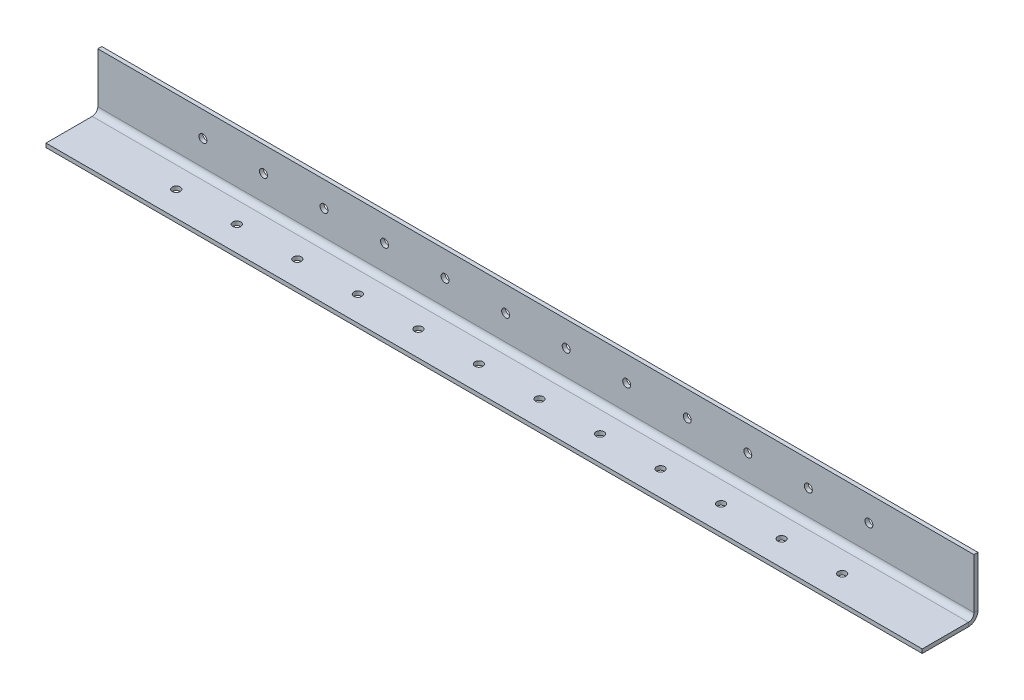
ISO-10303-21;
HEADER;
FILE_DESCRIPTION(('STEP AP214'),'2;1');
FILE_NAME('part.step','',(''),(''),'','','');
FILE_SCHEMA(('AUTOMOTIVE_DESIGN { 1 0 10303 214 1 1 1 1 }'));
ENDSEC;
DATA;
#1=APPLICATION_CONTEXT('core data for automotive mechanical design processes');
#2=APPLICATION_PROTOCOL_DEFINITION('international standard','automotive_design',2000,#1);
#3=PRODUCT_CONTEXT('',#1,'mechanical');
#4=PRODUCT('Part','Part','',(#3));
#5=PRODUCT_RELATED_PRODUCT_CATEGORY('part','',(#4));
#6=PRODUCT_DEFINITION_FORMATION('','',#4);
#7=PRODUCT_DEFINITION_CONTEXT('part definition',#1,'design');
#8=PRODUCT_DEFINITION('design','',#6,#7);
#9=PRODUCT_DEFINITION_SHAPE('','',#8);
#10=(LENGTH_UNIT() NAMED_UNIT(*) SI_UNIT(.MILLI.,.METRE.));
#11=(NAMED_UNIT(*) PLANE_ANGLE_UNIT() SI_UNIT($,.RADIAN.));
#12=(NAMED_UNIT(*) SI_UNIT($,.STERADIAN.) SOLID_ANGLE_UNIT());
#13=UNCERTAINTY_MEASURE_WITH_UNIT(LENGTH_MEASURE(1.E-05),#10,'distance_accuracy_value','');
#14=(GEOMETRIC_REPRESENTATION_CONTEXT(3) GLOBAL_UNCERTAINTY_ASSIGNED_CONTEXT((#13)) GLOBAL_UNIT_ASSIGNED_CONTEXT((#10,
#11,#12)) REPRESENTATION_CONTEXT('',''));
#15=CARTESIAN_POINT('',(0.,0.,0.));
#16=DIRECTION('',(0.,0.,1.));
#17=DIRECTION('',(1.,0.,0.));
#18=AXIS2_PLACEMENT_3D('',#15,#16,#17);
#19=CARTESIAN_POINT('',(836.,12.,0.));
#20=DIRECTION('',(0.,0.,-1.));
#21=DIRECTION('',(-1.,0.,0.));
#22=AXIS2_PLACEMENT_3D('',#19,#20,#21);
#23=CYLINDRICAL_SURFACE('',#22,10.0000000000001);
#24=CARTESIAN_POINT('',(836.,12.,0.));
#25=DIRECTION('',(0.,0.,-1.));
#26=DIRECTION('',(-1.,0.,0.));
#27=AXIS2_PLACEMENT_3D('',#24,#25,#26);
#28=CIRCLE('',#27,10.0000000000001);
#29=CARTESIAN_POINT('',(826.,12.,0.));
#30=VERTEX_POINT('',#29);
#31=EDGE_CURVE('E82',#30,#30,#28,.T.);
#32=ORIENTED_EDGE('',*,*,#31,.F.);
#33=EDGE_LOOP('',(#32));
#34=FACE_BOUND('',#33,.T.);
#35=CARTESIAN_POINT('',(836.,12.,-9.99999999999998));
#36=DIRECTION('',(0.,0.,-1.));
#37=DIRECTION('',(-1.,0.,0.));
#38=AXIS2_PLACEMENT_3D('',#35,#36,#37);
#39=CIRCLE('',#38,10.0000000000001);
#40=CARTESIAN_POINT('',(826.,12.,-9.99999999999998));
#41=VERTEX_POINT('',#40);
#42=EDGE_CURVE('E15',#41,#41,#39,.T.);
#43=ORIENTED_EDGE('',*,*,#42,.T.);
#44=EDGE_LOOP('',(#43));
#45=FACE_BOUND('',#44,.T.);
#46=ADVANCED_FACE('F74',(#34,#45),#23,.F.);
#47=CARTESIAN_POINT('',(684.,12.,0.));
#48=DIRECTION('',(0.,0.,-1.));
#49=DIRECTION('',(-1.,0.,0.));
#50=AXIS2_PLACEMENT_3D('',#47,#48,#49);
#51=CYLINDRICAL_SURFACE('',#50,10.0000000000001);
#52=CARTESIAN_POINT('',(684.,12.,0.));
#53=DIRECTION('',(0.,0.,-1.));
#54=DIRECTION('',(-1.,0.,0.));
#55=AXIS2_PLACEMENT_3D('',#52,#53,#54);
#56=CIRCLE('',#55,10.0000000000001);
#57=CARTESIAN_POINT('',(674.,12.,0.));
#58=VERTEX_POINT('',#57);
#59=EDGE_CURVE('E210',#58,#58,#56,.T.);
#60=ORIENTED_EDGE('',*,*,#59,.F.);
#61=EDGE_LOOP('',(#60));
#62=FACE_BOUND('',#61,.T.);
#63=CARTESIAN_POINT('',(684.,12.,-9.99999999999998));
#64=DIRECTION('',(0.,0.,-1.));
#65=DIRECTION('',(-1.,0.,0.));
#66=AXIS2_PLACEMENT_3D('',#63,#64,#65);
#67=CIRCLE('',#66,10.0000000000001);
#68=CARTESIAN_POINT('',(674.,12.,-9.99999999999998));
#69=VERTEX_POINT('',#68);
#70=EDGE_CURVE('E214',#69,#69,#67,.T.);
#71=ORIENTED_EDGE('',*,*,#70,.T.);
#72=EDGE_LOOP('',(#71));
#73=FACE_BOUND('',#72,.T.);
#74=ADVANCED_FACE('F225',(#62,#73),#51,.F.);
#75=CARTESIAN_POINT('',(532.,12.,0.));
#76=DIRECTION('',(0.,0.,-1.));
#77=DIRECTION('',(-1.,0.,0.));
#78=AXIS2_PLACEMENT_3D('',#75,#76,#77);
#79=CYLINDRICAL_SURFACE('',#78,10.0000000000001);
#80=CARTESIAN_POINT('',(532.,12.,0.));
#81=DIRECTION('',(0.,0.,-1.));
#82=DIRECTION('',(-1.,0.,0.));
#83=AXIS2_PLACEMENT_3D('',#80,#81,#82);
#84=CIRCLE('',#83,10.0000000000001);
#85=CARTESIAN_POINT('',(522.,12.,0.));
#86=VERTEX_POINT('',#85);
#87=EDGE_CURVE('E202',#86,#86,#84,.T.);
#88=ORIENTED_EDGE('',*,*,#87,.F.);
#89=EDGE_LOOP('',(#88));
#90=FACE_BOUND('',#89,.T.);
#91=CARTESIAN_POINT('',(532.,12.,-9.99999999999999));
#92=DIRECTION('',(0.,0.,-1.));
#93=DIRECTION('',(-1.,0.,0.));
#94=AXIS2_PLACEMENT_3D('',#91,#92,#93);
#95=CIRCLE('',#94,10.0000000000001);
#96=CARTESIAN_POINT('',(522.,12.,-9.99999999999999));
#97=VERTEX_POINT('',#96);
#98=EDGE_CURVE('E206',#97,#97,#95,.T.);
#99=ORIENTED_EDGE('',*,*,#98,.T.);
#100=EDGE_LOOP('',(#99));
#101=FACE_BOUND('',#100,.T.);
#102=ADVANCED_FACE('F279',(#90,#101),#79,.F.);
#103=CARTESIAN_POINT('',(380.,12.,0.));
#104=DIRECTION('',(0.,0.,-1.));
#105=DIRECTION('',(-1.,0.,0.));
#106=AXIS2_PLACEMENT_3D('',#103,#104,#105);
#107=CYLINDRICAL_SURFACE('',#106,10.0000000000001);
#108=CARTESIAN_POINT('',(380.,12.,0.));
#109=DIRECTION('',(0.,0.,-1.));
#110=DIRECTION('',(-1.,0.,0.));
#111=AXIS2_PLACEMENT_3D('',#108,#109,#110);
#112=CIRCLE('',#111,10.0000000000001);
#113=CARTESIAN_POINT('',(370.,12.,0.));
#114=VERTEX_POINT('',#113);
#115=EDGE_CURVE('E194',#114,#114,#112,.T.);
#116=ORIENTED_EDGE('',*,*,#115,.F.);
#117=EDGE_LOOP('',(#116));
#118=FACE_BOUND('',#117,.T.);
#119=CARTESIAN_POINT('',(380.,12.,-9.99999999999999));
#120=DIRECTION('',(0.,0.,-1.));
#121=DIRECTION('',(-1.,0.,0.));
#122=AXIS2_PLACEMENT_3D('',#119,#120,#121);
#123=CIRCLE('',#122,10.0000000000001);
#124=CARTESIAN_POINT('',(370.,12.,-9.99999999999999));
#125=VERTEX_POINT('',#124);
#126=EDGE_CURVE('E198',#125,#125,#123,.T.);
#127=ORIENTED_EDGE('',*,*,#126,.T.);
#128=EDGE_LOOP('',(#127));
#129=FACE_BOUND('',#128,.T.);
#130=ADVANCED_FACE('F275',(#118,#129),#107,.F.);
#131=CARTESIAN_POINT('',(228.,12.,0.));
#132=DIRECTION('',(0.,0.,-1.));
#133=DIRECTION('',(-1.,0.,0.));
#134=AXIS2_PLACEMENT_3D('',#131,#132,#133);
#135=CYLINDRICAL_SURFACE('',#134,10.0000000000001);
#136=CARTESIAN_POINT('',(228.,12.,0.));
#137=DIRECTION('',(0.,0.,-1.));
#138=DIRECTION('',(-1.,0.,0.));
#139=AXIS2_PLACEMENT_3D('',#136,#137,#138);
#140=CIRCLE('',#139,10.0000000000001);
#141=CARTESIAN_POINT('',(218.,12.,0.));
#142=VERTEX_POINT('',#141);
#143=EDGE_CURVE('E186',#142,#142,#140,.T.);
#144=ORIENTED_EDGE('',*,*,#143,.F.);
#145=EDGE_LOOP('',(#144));
#146=FACE_BOUND('',#145,.T.);
#147=CARTESIAN_POINT('',(228.,12.,-9.99999999999999));
#148=DIRECTION('',(0.,0.,-1.));
#149=DIRECTION('',(-1.,0.,0.));
#150=AXIS2_PLACEMENT_3D('',#147,#148,#149);
#151=CIRCLE('',#150,10.0000000000001);
#152=CARTESIAN_POINT('',(218.,12.,-9.99999999999999));
#153=VERTEX_POINT('',#152);
#154=EDGE_CURVE('E190',#153,#153,#151,.T.);
#155=ORIENTED_EDGE('',*,*,#154,.T.);
#156=EDGE_LOOP('',(#155));
#157=FACE_BOUND('',#156,.T.);
#158=ADVANCED_FACE('F271',(#146,#157),#135,.F.);
#159=CARTESIAN_POINT('',(75.9999999999998,12.,0.));
#160=DIRECTION('',(0.,0.,-1.));
#161=DIRECTION('',(-1.,0.,0.));
#162=AXIS2_PLACEMENT_3D('',#159,#160,#161);
#163=CYLINDRICAL_SURFACE('',#162,10.0000000000001);
#164=CARTESIAN_POINT('',(75.9999999999998,12.,0.));
#165=DIRECTION('',(0.,0.,-1.));
#166=DIRECTION('',(-1.,0.,0.));
#167=AXIS2_PLACEMENT_3D('',#164,#165,#166);
#168=CIRCLE('',#167,10.0000000000001);
#169=CARTESIAN_POINT('',(65.9999999999998,12.,0.));
#170=VERTEX_POINT('',#169);
#171=EDGE_CURVE('E178',#170,#170,#168,.T.);
#172=ORIENTED_EDGE('',*,*,#171,.F.);
#173=EDGE_LOOP('',(#172));
#174=FACE_BOUND('',#173,.T.);
#175=CARTESIAN_POINT('',(75.9999999999998,12.,-9.99999999999999));
#176=DIRECTION('',(0.,0.,-1.));
#177=DIRECTION('',(-1.,0.,0.));
#178=AXIS2_PLACEMENT_3D('',#175,#176,#177);
#179=CIRCLE('',#178,10.0000000000001);
#180=CARTESIAN_POINT('',(65.9999999999998,12.,-9.99999999999999));
#181=VERTEX_POINT('',#180);
#182=EDGE_CURVE('E182',#181,#181,#179,.T.);
#183=ORIENTED_EDGE('',*,*,#182,.T.);
#184=EDGE_LOOP('',(#183));
#185=FACE_BOUND('',#184,.T.);
#186=ADVANCED_FACE('F267',(#174,#185),#163,.F.);
#187=CARTESIAN_POINT('',(-76.0000000000001,12.,0.));
#188=DIRECTION('',(0.,0.,-1.));
#189=DIRECTION('',(-1.,0.,0.));
#190=AXIS2_PLACEMENT_3D('',#187,#188,#189);
#191=CYLINDRICAL_SURFACE('',#190,10.0000000000001);
#192=CARTESIAN_POINT('',(-76.0000000000001,12.,0.));
#193=DIRECTION('',(0.,0.,-1.));
#194=DIRECTION('',(-1.,0.,0.));
#195=AXIS2_PLACEMENT_3D('',#192,#193,#194);
#196=CIRCLE('',#195,10.0000000000001);
#197=CARTESIAN_POINT('',(-86.0000000000002,12.,0.));
#198=VERTEX_POINT('',#197);
#199=EDGE_CURVE('E170',#198,#198,#196,.T.);
#200=ORIENTED_EDGE('',*,*,#199,.F.);
#201=EDGE_LOOP('',(#200));
#202=FACE_BOUND('',#201,.T.);
#203=CARTESIAN_POINT('',(-76.0000000000001,12.,-9.99999999999999));
#204=DIRECTION('',(0.,0.,-1.));
#205=DIRECTION('',(-1.,0.,0.));
#206=AXIS2_PLACEMENT_3D('',#203,#204,#205);
#207=CIRCLE('',#206,10.0000000000001);
#208=CARTESIAN_POINT('',(-86.0000000000002,12.,-9.99999999999999));
#209=VERTEX_POINT('',#208);
#210=EDGE_CURVE('E174',#209,#209,#207,.T.);
#211=ORIENTED_EDGE('',*,*,#210,.T.);
#212=EDGE_LOOP('',(#211));
#213=FACE_BOUND('',#212,.T.);
#214=ADVANCED_FACE('F263',(#202,#213),#191,.F.);
#215=CARTESIAN_POINT('',(-228.,12.,0.));
#216=DIRECTION('',(0.,0.,-1.));
#217=DIRECTION('',(-1.,0.,0.));
#218=AXIS2_PLACEMENT_3D('',#215,#216,#217);
#219=CYLINDRICAL_SURFACE('',#218,10.0000000000001);
#220=CARTESIAN_POINT('',(-228.,12.,0.));
#221=DIRECTION('',(0.,0.,-1.));
#222=DIRECTION('',(-1.,0.,0.));
#223=AXIS2_PLACEMENT_3D('',#220,#221,#222);
#224=CIRCLE('',#223,10.0000000000001);
#225=CARTESIAN_POINT('',(-238.,12.,0.));
#226=VERTEX_POINT('',#225);
#227=EDGE_CURVE('E162',#226,#226,#224,.T.);
#228=ORIENTED_EDGE('',*,*,#227,.F.);
#229=EDGE_LOOP('',(#228));
#230=FACE_BOUND('',#229,.T.);
#231=CARTESIAN_POINT('',(-228.,12.,-9.99999999999999));
#232=DIRECTION('',(0.,0.,-1.));
#233=DIRECTION('',(-1.,0.,0.));
#234=AXIS2_PLACEMENT_3D('',#231,#232,#233);
#235=CIRCLE('',#234,10.0000000000001);
#236=CARTESIAN_POINT('',(-238.,12.,-9.99999999999999));
#237=VERTEX_POINT('',#236);
#238=EDGE_CURVE('E166',#237,#237,#235,.T.);
#239=ORIENTED_EDGE('',*,*,#238,.T.);
#240=EDGE_LOOP('',(#239));
#241=FACE_BOUND('',#240,.T.);
#242=ADVANCED_FACE('F259',(#230,#241),#219,.F.);
#243=CARTESIAN_POINT('',(-380.,12.,0.));
#244=DIRECTION('',(0.,0.,-1.));
#245=DIRECTION('',(-1.,0.,0.));
#246=AXIS2_PLACEMENT_3D('',#243,#244,#245);
#247=CYLINDRICAL_SURFACE('',#246,10.0000000000001);
#248=CARTESIAN_POINT('',(-380.,12.,0.));
#249=DIRECTION('',(0.,0.,-1.));
#250=DIRECTION('',(-1.,0.,0.));
#251=AXIS2_PLACEMENT_3D('',#248,#249,#250);
#252=CIRCLE('',#251,10.0000000000001);
#253=CARTESIAN_POINT('',(-390.,12.,0.));
#254=VERTEX_POINT('',#253);
#255=EDGE_CURVE('E154',#254,#254,#252,.T.);
#256=ORIENTED_EDGE('',*,*,#255,.F.);
#257=EDGE_LOOP('',(#256));
#258=FACE_BOUND('',#257,.T.);
#259=CARTESIAN_POINT('',(-380.,12.,-9.99999999999999));
#260=DIRECTION('',(0.,0.,-1.));
#261=DIRECTION('',(-1.,0.,0.));
#262=AXIS2_PLACEMENT_3D('',#259,#260,#261);
#263=CIRCLE('',#262,10.0000000000001);
#264=CARTESIAN_POINT('',(-390.,12.,-9.99999999999999));
#265=VERTEX_POINT('',#264);
#266=EDGE_CURVE('E158',#265,#265,#263,.T.);
#267=ORIENTED_EDGE('',*,*,#266,.T.);
#268=EDGE_LOOP('',(#267));
#269=FACE_BOUND('',#268,.T.);
#270=ADVANCED_FACE('F255',(#258,#269),#247,.F.);
#271=CARTESIAN_POINT('',(-532.,12.,0.));
#272=DIRECTION('',(0.,0.,-1.));
#273=DIRECTION('',(-1.,0.,0.));
#274=AXIS2_PLACEMENT_3D('',#271,#272,#273);
#275=CYLINDRICAL_SURFACE('',#274,10.0000000000001);
#276=CARTESIAN_POINT('',(-532.,12.,0.));
#277=DIRECTION('',(0.,0.,-1.));
#278=DIRECTION('',(-1.,0.,0.));
#279=AXIS2_PLACEMENT_3D('',#276,#277,#278);
#280=CIRCLE('',#279,10.0000000000001);
#281=CARTESIAN_POINT('',(-542.,12.,0.));
#282=VERTEX_POINT('',#281);
#283=EDGE_CURVE('E118',#282,#282,#280,.T.);
#284=ORIENTED_EDGE('',*,*,#283,.F.);
#285=EDGE_LOOP('',(#284));
#286=FACE_BOUND('',#285,.T.);
#287=CARTESIAN_POINT('',(-532.,12.,-10.));
#288=DIRECTION('',(0.,0.,-1.));
#289=DIRECTION('',(-1.,0.,0.));
#290=AXIS2_PLACEMENT_3D('',#287,#288,#289);
#291=CIRCLE('',#290,10.0000000000001);
#292=CARTESIAN_POINT('',(-542.,12.,-10.));
#293=VERTEX_POINT('',#292);
#294=EDGE_CURVE('E150',#293,#293,#291,.T.);
#295=ORIENTED_EDGE('',*,*,#294,.T.);
#296=EDGE_LOOP('',(#295));
#297=FACE_BOUND('',#296,.T.);
#298=ADVANCED_FACE('F239',(#286,#297),#275,.F.);
#299=CARTESIAN_POINT('',(1100.,-75.,-10.));
#300=DIRECTION('',(1.,0.,0.));
#301=DIRECTION('',(0.,0.,-1.));
#302=AXIS2_PLACEMENT_3D('',#299,#300,#301);
#303=PLANE('',#302);
#304=DIRECTION('',(0.,1.,0.));
#305=VECTOR('',#304,1.);
#306=CARTESIAN_POINT('',(1100.,-75.,0.));
#307=LINE('',#306,#305);
#308=CARTESIAN_POINT('',(1100.,-51.,0.));
#309=VERTEX_POINT('',#308);
#310=CARTESIAN_POINT('',(1100.,75.,0.));
#311=VERTEX_POINT('',#310);
#312=EDGE_CURVE('E135',#309,#311,#307,.T.);
#313=ORIENTED_EDGE('',*,*,#312,.F.);
#314=DIRECTION('',(0.,0.,-1.));
#315=VECTOR('',#314,1.);
#316=CARTESIAN_POINT('',(1100.,-51.,0.));
#317=LINE('',#316,#315);
#318=CARTESIAN_POINT('',(1100.,-51.,-9.99999999999997));
#319=VERTEX_POINT('',#318);
#320=EDGE_CURVE('E878',#309,#319,#317,.T.);
#321=ORIENTED_EDGE('',*,*,#320,.T.);
#322=DIRECTION('',(0.,1.,0.));
#323=VECTOR('',#322,1.);
#324=CARTESIAN_POINT('',(1100.,-75.,-10.));
#325=LINE('',#324,#323);
#326=CARTESIAN_POINT('',(1100.,75.,-10.));
#327=VERTEX_POINT('',#326);
#328=EDGE_CURVE('E130',#319,#327,#325,.T.);
#329=ORIENTED_EDGE('',*,*,#328,.T.);
#330=DIRECTION('',(0.,0.,1.));
#331=VECTOR('',#330,1.);
#332=CARTESIAN_POINT('',(1100.,75.,-10.));
#333=LINE('',#332,#331);
#334=EDGE_CURVE('E119',#327,#311,#333,.T.);
#335=ORIENTED_EDGE('',*,*,#334,.T.);
#336=EDGE_LOOP('',(#313,#321,#329,#335));
#337=FACE_BOUND('',#336,.T.);
#338=ADVANCED_FACE('F230',(#337),#303,.T.);
#339=CARTESIAN_POINT('',(0.,0.,-10.));
#340=DIRECTION('',(0.,0.,-1.));
#341=DIRECTION('',(-1.,0.,0.));
#342=AXIS2_PLACEMENT_3D('',#339,#340,#341);
#343=PLANE('',#342);
#344=CARTESIAN_POINT('',(-684.,12.,-10.));
#345=DIRECTION('',(0.,0.,-1.));
#346=DIRECTION('',(-1.,0.,0.));
#347=AXIS2_PLACEMENT_3D('',#344,#345,#346);
#348=CIRCLE('',#347,10.0000000000001);
#349=CARTESIAN_POINT('',(-694.,12.,-10.));
#350=VERTEX_POINT('',#349);
#351=EDGE_CURVE('E712',#350,#350,#348,.T.);
#352=ORIENTED_EDGE('',*,*,#351,.F.);
#353=EDGE_LOOP('',(#352));
#354=FACE_BOUND('',#353,.T.);
#355=CARTESIAN_POINT('',(-836.,12.,-10.));
#356=DIRECTION('',(0.,0.,-1.));
#357=DIRECTION('',(-1.,0.,0.));
#358=AXIS2_PLACEMENT_3D('',#355,#356,#357);
#359=CIRCLE('',#358,10.0000000000001);
#360=CARTESIAN_POINT('',(-846.,12.,-10.));
#361=VERTEX_POINT('',#360);
#362=EDGE_CURVE('E728',#361,#361,#359,.T.);
#363=ORIENTED_EDGE('',*,*,#362,.F.);
#364=EDGE_LOOP('',(#363));
#365=FACE_BOUND('',#364,.T.);
#366=ORIENTED_EDGE('',*,*,#328,.F.);
#367=DIRECTION('',(1.,0.,0.));
#368=VECTOR('',#367,1.);
#369=CARTESIAN_POINT('',(1100.,-51.,-9.99999999999997));
#370=LINE('',#369,#368);
#371=CARTESIAN_POINT('',(-1100.,-51.,-10.));
#372=VERTEX_POINT('',#371);
#373=EDGE_CURVE('E871',#319,#372,#370,.F.);
#374=ORIENTED_EDGE('',*,*,#373,.T.);
#375=DIRECTION('',(0.,-1.,0.));
#376=VECTOR('',#375,1.);
#377=CARTESIAN_POINT('',(-1100.,-75.,-10.));
#378=LINE('',#377,#376);
#379=CARTESIAN_POINT('',(-1100.,75.,-10.));
#380=VERTEX_POINT('',#379);
#381=EDGE_CURVE('E146',#380,#372,#378,.T.);
#382=ORIENTED_EDGE('',*,*,#381,.F.);
#383=DIRECTION('',(-1.,0.,0.));
#384=VECTOR('',#383,1.);
#385=CARTESIAN_POINT('',(-1100.,75.,-10.));
#386=LINE('',#385,#384);
#387=EDGE_CURVE('E116',#327,#380,#386,.T.);
#388=ORIENTED_EDGE('',*,*,#387,.F.);
#389=EDGE_LOOP('',(#366,#374,#382,#388));
#390=FACE_BOUND('',#389,.T.);
#391=ORIENTED_EDGE('',*,*,#294,.F.);
#392=EDGE_LOOP('',(#391));
#393=FACE_BOUND('',#392,.T.);
#394=ORIENTED_EDGE('',*,*,#266,.F.);
#395=EDGE_LOOP('',(#394));
#396=FACE_BOUND('',#395,.T.);
#397=ORIENTED_EDGE('',*,*,#238,.F.);
#398=EDGE_LOOP('',(#397));
#399=FACE_BOUND('',#398,.T.);
#400=ORIENTED_EDGE('',*,*,#210,.F.);
#401=EDGE_LOOP('',(#400));
#402=FACE_BOUND('',#401,.T.);
#403=ORIENTED_EDGE('',*,*,#182,.F.);
#404=EDGE_LOOP('',(#403));
#405=FACE_BOUND('',#404,.T.);
#406=ORIENTED_EDGE('',*,*,#154,.F.);
#407=EDGE_LOOP('',(#406));
#408=FACE_BOUND('',#407,.T.);
#409=ORIENTED_EDGE('',*,*,#126,.F.);
#410=EDGE_LOOP('',(#409));
#411=FACE_BOUND('',#410,.T.);
#412=ORIENTED_EDGE('',*,*,#98,.F.);
#413=EDGE_LOOP('',(#412));
#414=FACE_BOUND('',#413,.T.);
#415=ORIENTED_EDGE('',*,*,#70,.F.);
#416=EDGE_LOOP('',(#415));
#417=FACE_BOUND('',#416,.T.);
#418=ORIENTED_EDGE('',*,*,#42,.F.);
#419=EDGE_LOOP('',(#418));
#420=FACE_BOUND('',#419,.T.);
#421=ADVANCED_FACE('F228',(#354,#365,#390,#393,#396,#399,#402,#405,#408,#411,#414,#417,#420),
#343,.T.);
#422=CARTESIAN_POINT('',(0.,0.,0.));
#423=DIRECTION('',(0.,0.,-1.));
#424=DIRECTION('',(-1.,0.,0.));
#425=AXIS2_PLACEMENT_3D('',#422,#423,#424);
#426=PLANE('',#425);
#427=CARTESIAN_POINT('',(-684.,12.,0.));
#428=DIRECTION('',(0.,0.,-1.));
#429=DIRECTION('',(-1.,0.,0.));
#430=AXIS2_PLACEMENT_3D('',#427,#428,#429);
#431=CIRCLE('',#430,10.0000000000001);
#432=CARTESIAN_POINT('',(-694.,12.,0.));
#433=VERTEX_POINT('',#432);
#434=EDGE_CURVE('E710',#433,#433,#431,.T.);
#435=ORIENTED_EDGE('',*,*,#434,.T.);
#436=EDGE_LOOP('',(#435));
#437=FACE_BOUND('',#436,.T.);
#438=CARTESIAN_POINT('',(-836.,12.,0.));
#439=DIRECTION('',(0.,0.,-1.));
#440=DIRECTION('',(-1.,0.,0.));
#441=AXIS2_PLACEMENT_3D('',#438,#439,#440);
#442=CIRCLE('',#441,10.0000000000001);
#443=CARTESIAN_POINT('',(-846.,12.,0.));
#444=VERTEX_POINT('',#443);
#445=EDGE_CURVE('E808',#444,#444,#442,.T.);
#446=ORIENTED_EDGE('',*,*,#445,.T.);
#447=EDGE_LOOP('',(#446));
#448=FACE_BOUND('',#447,.T.);
#449=DIRECTION('',(1.,0.,0.));
#450=VECTOR('',#449,1.);
#451=CARTESIAN_POINT('',(1100.,-51.,0.));
#452=LINE('',#451,#450);
#453=CARTESIAN_POINT('',(-1100.,-51.,0.));
#454=VERTEX_POINT('',#453);
#455=EDGE_CURVE('E886',#309,#454,#452,.F.);
#456=ORIENTED_EDGE('',*,*,#455,.F.);
#457=ORIENTED_EDGE('',*,*,#312,.T.);
#458=DIRECTION('',(-1.,0.,0.));
#459=VECTOR('',#458,1.);
#460=CARTESIAN_POINT('',(-1100.,75.,0.));
#461=LINE('',#460,#459);
#462=CARTESIAN_POINT('',(-1100.,75.,0.));
#463=VERTEX_POINT('',#462);
#464=EDGE_CURVE('E114',#311,#463,#461,.T.);
#465=ORIENTED_EDGE('',*,*,#464,.T.);
#466=DIRECTION('',(0.,-1.,0.));
#467=VECTOR('',#466,1.);
#468=CARTESIAN_POINT('',(-1100.,-75.,0.));
#469=LINE('',#468,#467);
#470=EDGE_CURVE('E123',#463,#454,#469,.T.);
#471=ORIENTED_EDGE('',*,*,#470,.T.);
#472=EDGE_LOOP('',(#456,#457,#465,#471));
#473=FACE_BOUND('',#472,.T.);
#474=ORIENTED_EDGE('',*,*,#283,.T.);
#475=EDGE_LOOP('',(#474));
#476=FACE_BOUND('',#475,.T.);
#477=ORIENTED_EDGE('',*,*,#255,.T.);
#478=EDGE_LOOP('',(#477));
#479=FACE_BOUND('',#478,.T.);
#480=ORIENTED_EDGE('',*,*,#227,.T.);
#481=EDGE_LOOP('',(#480));
#482=FACE_BOUND('',#481,.T.);
#483=ORIENTED_EDGE('',*,*,#199,.T.);
#484=EDGE_LOOP('',(#483));
#485=FACE_BOUND('',#484,.T.);
#486=ORIENTED_EDGE('',*,*,#171,.T.);
#487=EDGE_LOOP('',(#486));
#488=FACE_BOUND('',#487,.T.);
#489=ORIENTED_EDGE('',*,*,#143,.T.);
#490=EDGE_LOOP('',(#489));
#491=FACE_BOUND('',#490,.T.);
#492=ORIENTED_EDGE('',*,*,#115,.T.);
#493=EDGE_LOOP('',(#492));
#494=FACE_BOUND('',#493,.T.);
#495=ORIENTED_EDGE('',*,*,#87,.T.);
#496=EDGE_LOOP('',(#495));
#497=FACE_BOUND('',#496,.T.);
#498=ORIENTED_EDGE('',*,*,#59,.T.);
#499=EDGE_LOOP('',(#498));
#500=FACE_BOUND('',#499,.T.);
#501=ORIENTED_EDGE('',*,*,#31,.T.);
#502=EDGE_LOOP('',(#501));
#503=FACE_BOUND('',#502,.T.);
#504=ADVANCED_FACE('F132',(#437,#448,#473,#476,#479,#482,#485,#488,#491,#494,#497,#500,#503),
#426,.F.);
#505=CARTESIAN_POINT('',(-1100.,-75.,-10.));
#506=DIRECTION('',(-1.,0.,0.));
#507=DIRECTION('',(0.,0.,1.));
#508=AXIS2_PLACEMENT_3D('',#505,#506,#507);
#509=PLANE('',#508);
#510=DIRECTION('',(0.,0.,-1.));
#511=VECTOR('',#510,1.);
#512=CARTESIAN_POINT('',(-1100.,-51.,0.));
#513=LINE('',#512,#511);
#514=EDGE_CURVE('E126',#454,#372,#513,.T.);
#515=ORIENTED_EDGE('',*,*,#514,.F.);
#516=ORIENTED_EDGE('',*,*,#470,.F.);
#517=DIRECTION('',(0.,0.,1.));
#518=VECTOR('',#517,1.);
#519=CARTESIAN_POINT('',(-1100.,75.,-10.));
#520=LINE('',#519,#518);
#521=EDGE_CURVE('E98',#380,#463,#520,.T.);
#522=ORIENTED_EDGE('',*,*,#521,.F.);
#523=ORIENTED_EDGE('',*,*,#381,.T.);
#524=EDGE_LOOP('',(#515,#516,#522,#523));
#525=FACE_BOUND('',#524,.T.);
#526=ADVANCED_FACE('F124',(#525),#509,.T.);
#527=CARTESIAN_POINT('',(-1100.,75.,-10.));
#528=DIRECTION('',(0.,1.,0.));
#529=DIRECTION('',(0.,0.,1.));
#530=AXIS2_PLACEMENT_3D('',#527,#528,#529);
#531=PLANE('',#530);
#532=ORIENTED_EDGE('',*,*,#464,.F.);
#533=ORIENTED_EDGE('',*,*,#334,.F.);
#534=ORIENTED_EDGE('',*,*,#387,.T.);
#535=ORIENTED_EDGE('',*,*,#521,.T.);
#536=EDGE_LOOP('',(#532,#533,#534,#535));
#537=FACE_BOUND('',#536,.T.);
#538=ADVANCED_FACE('F111',(#537),#531,.T.);
#539=CARTESIAN_POINT('',(-1100.,-51.,14.));
#540=DIRECTION('',(-1.,0.,0.));
#541=DIRECTION('',(0.,0.,1.));
#542=AXIS2_PLACEMENT_3D('',#539,#540,#541);
#543=PLANE('',#542);
#544=DIRECTION('',(0.,1.,0.));
#545=VECTOR('',#544,1.);
#546=CARTESIAN_POINT('',(-1100.,-75.,13.9999999999999));
#547=LINE('',#546,#545);
#548=CARTESIAN_POINT('',(-1100.,-65.,14.));
#549=VERTEX_POINT('',#548);
#550=CARTESIAN_POINT('',(-1100.,-75.,13.9999999999999));
#551=VERTEX_POINT('',#550);
#552=EDGE_CURVE('E820',#549,#551,#547,.F.);
#553=ORIENTED_EDGE('',*,*,#552,.F.);
#554=CARTESIAN_POINT('',(-1100.,-51.,14.));
#555=DIRECTION('',(1.,0.,0.));
#556=DIRECTION('',(0.,0.,-1.));
#557=AXIS2_PLACEMENT_3D('',#554,#555,#556);
#558=CIRCLE('',#557,14.);
#559=EDGE_CURVE('E882',#454,#549,#558,.F.);
#560=ORIENTED_EDGE('',*,*,#559,.F.);
#561=ORIENTED_EDGE('',*,*,#514,.T.);
#562=CARTESIAN_POINT('',(-1100.,-51.,14.));
#563=DIRECTION('',(1.,0.,0.));
#564=DIRECTION('',(0.,0.,-1.));
#565=AXIS2_PLACEMENT_3D('',#562,#563,#564);
#566=CIRCLE('',#565,24.);
#567=EDGE_CURVE('E89',#372,#551,#566,.F.);
#568=ORIENTED_EDGE('',*,*,#567,.T.);
#569=EDGE_LOOP('',(#553,#560,#561,#568));
#570=FACE_BOUND('',#569,.T.);
#571=ADVANCED_FACE('F251',(#570),#543,.T.);
#572=CARTESIAN_POINT('',(1100.,-51.,14.));
#573=DIRECTION('',(-1.,0.,0.));
#574=DIRECTION('',(0.,0.,1.));
#575=AXIS2_PLACEMENT_3D('',#572,#573,#574);
#576=PLANE('',#575);
#577=CARTESIAN_POINT('',(1100.,-51.,14.));
#578=DIRECTION('',(1.,0.,0.));
#579=DIRECTION('',(0.,0.,-1.));
#580=AXIS2_PLACEMENT_3D('',#577,#578,#579);
#581=CIRCLE('',#580,14.);
#582=CARTESIAN_POINT('',(1100.,-65.,14.));
#583=VERTEX_POINT('',#582);
#584=EDGE_CURVE('E828',#583,#309,#581,.T.);
#585=ORIENTED_EDGE('',*,*,#584,.F.);
#586=DIRECTION('',(0.,1.,0.));
#587=VECTOR('',#586,1.);
#588=CARTESIAN_POINT('',(1100.,-65.,14.));
#589=LINE('',#588,#587);
#590=CARTESIAN_POINT('',(1100.,-75.,14.));
#591=VERTEX_POINT('',#590);
#592=EDGE_CURVE('E860',#583,#591,#589,.F.);
#593=ORIENTED_EDGE('',*,*,#592,.T.);
#594=CARTESIAN_POINT('',(1100.,-51.,14.));
#595=DIRECTION('',(1.,0.,0.));
#596=DIRECTION('',(0.,0.,-1.));
#597=AXIS2_PLACEMENT_3D('',#594,#595,#596);
#598=CIRCLE('',#597,24.);
#599=EDGE_CURVE('E875',#591,#319,#598,.T.);
#600=ORIENTED_EDGE('',*,*,#599,.T.);
#601=ORIENTED_EDGE('',*,*,#320,.F.);
#602=EDGE_LOOP('',(#585,#593,#600,#601));
#603=FACE_BOUND('',#602,.T.);
#604=ADVANCED_FACE('F245',(#603),#576,.F.);
#605=CARTESIAN_POINT('',(1100.,-51.,14.));
#606=DIRECTION('',(1.,0.,0.));
#607=DIRECTION('',(0.,-1.,0.));
#608=AXIS2_PLACEMENT_3D('',#605,#606,#607);
#609=CYLINDRICAL_SURFACE('',#608,24.);
#610=ORIENTED_EDGE('',*,*,#373,.F.);
#611=ORIENTED_EDGE('',*,*,#599,.F.);
#612=DIRECTION('',(1.,0.,0.));
#613=VECTOR('',#612,1.);
#614=CARTESIAN_POINT('',(-1100.,-75.,13.9999999999999));
#615=LINE('',#614,#613);
#616=EDGE_CURVE('E857',#591,#551,#615,.F.);
#617=ORIENTED_EDGE('',*,*,#616,.T.);
#618=ORIENTED_EDGE('',*,*,#567,.F.);
#619=EDGE_LOOP('',(#610,#611,#617,#618));
#620=FACE_BOUND('',#619,.T.);
#621=ADVANCED_FACE('F370',(#620),#609,.T.);
#622=CARTESIAN_POINT('',(1100.,-51.,14.));
#623=DIRECTION('',(1.,0.,0.));
#624=DIRECTION('',(0.,-1.,0.));
#625=AXIS2_PLACEMENT_3D('',#622,#623,#624);
#626=CYLINDRICAL_SURFACE('',#625,14.);
#627=ORIENTED_EDGE('',*,*,#455,.T.);
#628=ORIENTED_EDGE('',*,*,#559,.T.);
#629=DIRECTION('',(1.,0.,0.));
#630=VECTOR('',#629,1.);
#631=CARTESIAN_POINT('',(-1100.,-65.,14.));
#632=LINE('',#631,#630);
#633=EDGE_CURVE('E864',#549,#583,#632,.T.);
#634=ORIENTED_EDGE('',*,*,#633,.T.);
#635=ORIENTED_EDGE('',*,*,#584,.T.);
#636=EDGE_LOOP('',(#627,#628,#634,#635));
#637=FACE_BOUND('',#636,.T.);
#638=ADVANCED_FACE('F379',(#637),#626,.F.);
#639=CARTESIAN_POINT('',(-1100.,-75.,0.));
#640=DIRECTION('',(1.,0.,0.));
#641=DIRECTION('',(0.,0.,-1.));
#642=AXIS2_PLACEMENT_3D('',#639,#640,#641);
#643=PLANE('',#642);
#644=ORIENTED_EDGE('',*,*,#552,.T.);
#645=DIRECTION('',(0.,0.,-1.));
#646=VECTOR('',#645,1.);
#647=CARTESIAN_POINT('',(-1100.,-75.,-2.99126542806437E-13));
#648=LINE('',#647,#646);
#649=CARTESIAN_POINT('',(-1100.,-75.0000000000004,130.));
#650=VERTEX_POINT('',#649);
#651=EDGE_CURVE('E841',#650,#551,#648,.T.);
#652=ORIENTED_EDGE('',*,*,#651,.F.);
#653=DIRECTION('',(0.,1.,0.));
#654=VECTOR('',#653,1.);
#655=CARTESIAN_POINT('',(-1100.,-75.0000000000004,130.));
#656=LINE('',#655,#654);
#657=CARTESIAN_POINT('',(-1100.,-65.0000000000004,130.));
#658=VERTEX_POINT('',#657);
#659=EDGE_CURVE('E829',#650,#658,#656,.T.);
#660=ORIENTED_EDGE('',*,*,#659,.T.);
#661=DIRECTION('',(0.,0.,1.));
#662=VECTOR('',#661,1.);
#663=CARTESIAN_POINT('',(-1100.,-65.,0.));
#664=LINE('',#663,#662);
#665=EDGE_CURVE('E853',#658,#549,#664,.F.);
#666=ORIENTED_EDGE('',*,*,#665,.T.);
#667=EDGE_LOOP('',(#644,#652,#660,#666));
#668=FACE_BOUND('',#667,.T.);
#669=ADVANCED_FACE('F388',(#668),#643,.F.);
#670=CARTESIAN_POINT('',(1100.,-75.0000000000004,130.));
#671=DIRECTION('',(-1.,0.,0.));
#672=DIRECTION('',(0.,0.,1.));
#673=AXIS2_PLACEMENT_3D('',#670,#671,#672);
#674=PLANE('',#673);
#675=ORIENTED_EDGE('',*,*,#592,.F.);
#676=DIRECTION('',(0.,0.,-1.));
#677=VECTOR('',#676,1.);
#678=CARTESIAN_POINT('',(1100.,-65.0000000000004,130.));
#679=LINE('',#678,#677);
#680=CARTESIAN_POINT('',(1100.,-65.0000000000004,130.));
#681=VERTEX_POINT('',#680);
#682=EDGE_CURVE('E849',#583,#681,#679,.F.);
#683=ORIENTED_EDGE('',*,*,#682,.T.);
#684=DIRECTION('',(0.,1.,0.));
#685=VECTOR('',#684,1.);
#686=CARTESIAN_POINT('',(1100.,-75.0000000000004,130.));
#687=LINE('',#686,#685);
#688=CARTESIAN_POINT('',(1100.,-75.0000000000004,130.));
#689=VERTEX_POINT('',#688);
#690=EDGE_CURVE('E824',#689,#681,#687,.T.);
#691=ORIENTED_EDGE('',*,*,#690,.F.);
#692=DIRECTION('',(0.,0.,1.));
#693=VECTOR('',#692,1.);
#694=CARTESIAN_POINT('',(1100.,-75.,-2.1779655075567E-12));
#695=LINE('',#694,#693);
#696=EDGE_CURVE('E837',#591,#689,#695,.T.);
#697=ORIENTED_EDGE('',*,*,#696,.F.);
#698=EDGE_LOOP('',(#675,#683,#691,#697));
#699=FACE_BOUND('',#698,.T.);
#700=ADVANCED_FACE('F398',(#699),#674,.F.);
#701=CARTESIAN_POINT('',(0.,-75.,-2.99126542806437E-13));
#702=DIRECTION('',(0.,1.,0.));
#703=DIRECTION('',(0.,0.,1.));
#704=AXIS2_PLACEMENT_3D('',#701,#702,#703);
#705=PLANE('',#704);
#706=CARTESIAN_POINT('',(-684.,-75.0000000000002,67.));
#707=DIRECTION('',(0.,-1.,0.));
#708=DIRECTION('',(0.,0.,-1.));
#709=AXIS2_PLACEMENT_3D('',#706,#707,#708);
#710=CIRCLE('',#709,10.0000000000001);
#711=CARTESIAN_POINT('',(-684.,-75.0000000000002,56.9999999999999));
#712=VERTEX_POINT('',#711);
#713=EDGE_CURVE('E729',#712,#712,#710,.T.);
#714=ORIENTED_EDGE('',*,*,#713,.F.);
#715=EDGE_LOOP('',(#714));
#716=FACE_BOUND('',#715,.T.);
#717=CARTESIAN_POINT('',(-532.,-75.0000000000002,67.));
#718=DIRECTION('',(0.,-1.,0.));
#719=DIRECTION('',(0.,0.,-1.));
#720=AXIS2_PLACEMENT_3D('',#717,#718,#719);
#721=CIRCLE('',#720,10.0000000000001);
#722=CARTESIAN_POINT('',(-532.,-75.0000000000002,56.9999999999999));
#723=VERTEX_POINT('',#722);
#724=EDGE_CURVE('E737',#723,#723,#721,.T.);
#725=ORIENTED_EDGE('',*,*,#724,.F.);
#726=EDGE_LOOP('',(#725));
#727=FACE_BOUND('',#726,.T.);
#728=CARTESIAN_POINT('',(-380.,-75.0000000000002,67.));
#729=DIRECTION('',(0.,-1.,0.));
#730=DIRECTION('',(0.,0.,-1.));
#731=AXIS2_PLACEMENT_3D('',#728,#729,#730);
#732=CIRCLE('',#731,10.0000000000001);
#733=CARTESIAN_POINT('',(-380.,-75.0000000000002,56.9999999999999));
#734=VERTEX_POINT('',#733);
#735=EDGE_CURVE('E745',#734,#734,#732,.T.);
#736=ORIENTED_EDGE('',*,*,#735,.F.);
#737=EDGE_LOOP('',(#736));
#738=FACE_BOUND('',#737,.T.);
#739=CARTESIAN_POINT('',(-228.,-75.0000000000002,67.));
#740=DIRECTION('',(0.,-1.,0.));
#741=DIRECTION('',(0.,0.,-1.));
#742=AXIS2_PLACEMENT_3D('',#739,#740,#741);
#743=CIRCLE('',#742,10.0000000000001);
#744=CARTESIAN_POINT('',(-228.,-75.0000000000002,56.9999999999999));
#745=VERTEX_POINT('',#744);
#746=EDGE_CURVE('E753',#745,#745,#743,.T.);
#747=ORIENTED_EDGE('',*,*,#746,.F.);
#748=EDGE_LOOP('',(#747));
#749=FACE_BOUND('',#748,.T.);
#750=CARTESIAN_POINT('',(-76.0000000000001,-75.0000000000002,67.));
#751=DIRECTION('',(0.,-1.,0.));
#752=DIRECTION('',(0.,0.,-1.));
#753=AXIS2_PLACEMENT_3D('',#750,#751,#752);
#754=CIRCLE('',#753,10.0000000000001);
#755=CARTESIAN_POINT('',(-76.0000000000001,-75.0000000000002,56.9999999999999));
#756=VERTEX_POINT('',#755);
#757=EDGE_CURVE('E761',#756,#756,#754,.T.);
#758=ORIENTED_EDGE('',*,*,#757,.F.);
#759=EDGE_LOOP('',(#758));
#760=FACE_BOUND('',#759,.T.);
#761=CARTESIAN_POINT('',(75.9999999999998,-75.0000000000002,67.));
#762=DIRECTION('',(0.,-1.,0.));
#763=DIRECTION('',(0.,0.,-1.));
#764=AXIS2_PLACEMENT_3D('',#761,#762,#763);
#765=CIRCLE('',#764,10.0000000000001);
#766=CARTESIAN_POINT('',(75.9999999999998,-75.0000000000002,56.9999999999999));
#767=VERTEX_POINT('',#766);
#768=EDGE_CURVE('E769',#767,#767,#765,.T.);
#769=ORIENTED_EDGE('',*,*,#768,.F.);
#770=EDGE_LOOP('',(#769));
#771=FACE_BOUND('',#770,.T.);
#772=CARTESIAN_POINT('',(228.,-75.0000000000002,67.));
#773=DIRECTION('',(0.,-1.,0.));
#774=DIRECTION('',(0.,0.,-1.));
#775=AXIS2_PLACEMENT_3D('',#772,#773,#774);
#776=CIRCLE('',#775,10.0000000000001);
#777=CARTESIAN_POINT('',(228.,-75.0000000000002,56.9999999999999));
#778=VERTEX_POINT('',#777);
#779=EDGE_CURVE('E777',#778,#778,#776,.T.);
#780=ORIENTED_EDGE('',*,*,#779,.F.);
#781=EDGE_LOOP('',(#780));
#782=FACE_BOUND('',#781,.T.);
#783=CARTESIAN_POINT('',(380.,-75.0000000000002,67.));
#784=DIRECTION('',(0.,-1.,0.));
#785=DIRECTION('',(0.,0.,-1.));
#786=AXIS2_PLACEMENT_3D('',#783,#784,#785);
#787=CIRCLE('',#786,10.0000000000001);
#788=CARTESIAN_POINT('',(380.,-75.0000000000002,56.9999999999999));
#789=VERTEX_POINT('',#788);
#790=EDGE_CURVE('E785',#789,#789,#787,.T.);
#791=ORIENTED_EDGE('',*,*,#790,.F.);
#792=EDGE_LOOP('',(#791));
#793=FACE_BOUND('',#792,.T.);
#794=CARTESIAN_POINT('',(532.,-75.0000000000002,67.));
#795=DIRECTION('',(0.,-1.,0.));
#796=DIRECTION('',(0.,0.,-1.));
#797=AXIS2_PLACEMENT_3D('',#794,#795,#796);
#798=CIRCLE('',#797,10.0000000000001);
#799=CARTESIAN_POINT('',(532.,-75.0000000000002,56.9999999999999));
#800=VERTEX_POINT('',#799);
#801=EDGE_CURVE('E793',#800,#800,#798,.T.);
#802=ORIENTED_EDGE('',*,*,#801,.F.);
#803=EDGE_LOOP('',(#802));
#804=FACE_BOUND('',#803,.T.);
#805=CARTESIAN_POINT('',(684.,-75.0000000000002,67.));
#806=DIRECTION('',(0.,-1.,0.));
#807=DIRECTION('',(0.,0.,-1.));
#808=AXIS2_PLACEMENT_3D('',#805,#806,#807);
#809=CIRCLE('',#808,10.0000000000001);
#810=CARTESIAN_POINT('',(684.,-75.0000000000002,56.9999999999999));
#811=VERTEX_POINT('',#810);
#812=EDGE_CURVE('E801',#811,#811,#809,.T.);
#813=ORIENTED_EDGE('',*,*,#812,.F.);
#814=EDGE_LOOP('',(#813));
#815=FACE_BOUND('',#814,.T.);
#816=CARTESIAN_POINT('',(836.,-75.0000000000002,67.));
#817=DIRECTION('',(0.,-1.,0.));
#818=DIRECTION('',(0.,0.,-1.));
#819=AXIS2_PLACEMENT_3D('',#816,#817,#818);
#820=CIRCLE('',#819,10.0000000000001);
#821=CARTESIAN_POINT('',(836.,-75.0000000000002,56.9999999999999));
#822=VERTEX_POINT('',#821);
#823=EDGE_CURVE('E714',#822,#822,#820,.T.);
#824=ORIENTED_EDGE('',*,*,#823,.F.);
#825=EDGE_LOOP('',(#824));
#826=FACE_BOUND('',#825,.T.);
#827=CARTESIAN_POINT('',(-836.,-75.0000000000002,67.));
#828=DIRECTION('',(0.,-1.,0.));
#829=DIRECTION('',(0.,0.,-1.));
#830=AXIS2_PLACEMENT_3D('',#827,#828,#829);
#831=CIRCLE('',#830,10.0000000000001);
#832=CARTESIAN_POINT('',(-836.,-75.0000000000002,56.9999999999999));
#833=VERTEX_POINT('',#832);
#834=EDGE_CURVE('E812',#833,#833,#831,.T.);
#835=ORIENTED_EDGE('',*,*,#834,.F.);
#836=EDGE_LOOP('',(#835));
#837=FACE_BOUND('',#836,.T.);
#838=ORIENTED_EDGE('',*,*,#616,.F.);
#839=ORIENTED_EDGE('',*,*,#696,.T.);
#840=DIRECTION('',(-1.,0.,0.));
#841=VECTOR('',#840,1.);
#842=CARTESIAN_POINT('',(0.,-75.0000000000004,130.));
#843=LINE('',#842,#841);
#844=EDGE_CURVE('E833',#689,#650,#843,.T.);
#845=ORIENTED_EDGE('',*,*,#844,.T.);
#846=ORIENTED_EDGE('',*,*,#651,.T.);
#847=EDGE_LOOP('',(#838,#839,#845,#846));
#848=FACE_BOUND('',#847,.T.);
#849=ADVANCED_FACE('F408',(#716,#727,#738,#749,#760,#771,#782,#793,#804,#815,#826,#837,#848),
#705,.F.);
#850=CARTESIAN_POINT('',(0.,-65.,-2.64211729418006E-13));
#851=DIRECTION('',(0.,1.,0.));
#852=DIRECTION('',(0.,0.,1.));
#853=AXIS2_PLACEMENT_3D('',#850,#851,#852);
#854=PLANE('',#853);
#855=CARTESIAN_POINT('',(-684.,-65.0000000000002,67.));
#856=DIRECTION('',(0.,-1.,0.));
#857=DIRECTION('',(0.,0.,-1.));
#858=AXIS2_PLACEMENT_3D('',#855,#856,#857);
#859=CIRCLE('',#858,10.0000000000001);
#860=CARTESIAN_POINT('',(-684.,-65.0000000000002,56.9999999999999));
#861=VERTEX_POINT('',#860);
#862=EDGE_CURVE('E724',#861,#861,#859,.T.);
#863=ORIENTED_EDGE('',*,*,#862,.T.);
#864=EDGE_LOOP('',(#863));
#865=FACE_BOUND('',#864,.T.);
#866=CARTESIAN_POINT('',(-532.,-65.0000000000002,67.));
#867=DIRECTION('',(0.,-1.,0.));
#868=DIRECTION('',(0.,0.,-1.));
#869=AXIS2_PLACEMENT_3D('',#866,#867,#868);
#870=CIRCLE('',#869,10.0000000000001);
#871=CARTESIAN_POINT('',(-532.,-65.0000000000002,56.9999999999999));
#872=VERTEX_POINT('',#871);
#873=EDGE_CURVE('E733',#872,#872,#870,.T.);
#874=ORIENTED_EDGE('',*,*,#873,.T.);
#875=EDGE_LOOP('',(#874));
#876=FACE_BOUND('',#875,.T.);
#877=CARTESIAN_POINT('',(-380.,-65.0000000000002,67.));
#878=DIRECTION('',(0.,-1.,0.));
#879=DIRECTION('',(0.,0.,-1.));
#880=AXIS2_PLACEMENT_3D('',#877,#878,#879);
#881=CIRCLE('',#880,10.0000000000001);
#882=CARTESIAN_POINT('',(-380.,-65.0000000000002,56.9999999999999));
#883=VERTEX_POINT('',#882);
#884=EDGE_CURVE('E741',#883,#883,#881,.T.);
#885=ORIENTED_EDGE('',*,*,#884,.T.);
#886=EDGE_LOOP('',(#885));
#887=FACE_BOUND('',#886,.T.);
#888=CARTESIAN_POINT('',(-228.,-65.0000000000002,67.));
#889=DIRECTION('',(0.,-1.,0.));
#890=DIRECTION('',(0.,0.,-1.));
#891=AXIS2_PLACEMENT_3D('',#888,#889,#890);
#892=CIRCLE('',#891,10.0000000000001);
#893=CARTESIAN_POINT('',(-228.,-65.0000000000002,56.9999999999999));
#894=VERTEX_POINT('',#893);
#895=EDGE_CURVE('E749',#894,#894,#892,.T.);
#896=ORIENTED_EDGE('',*,*,#895,.T.);
#897=EDGE_LOOP('',(#896));
#898=FACE_BOUND('',#897,.T.);
#899=CARTESIAN_POINT('',(-76.0000000000001,-65.0000000000002,67.0000000000001));
#900=DIRECTION('',(0.,-1.,0.));
#901=DIRECTION('',(0.,0.,-1.));
#902=AXIS2_PLACEMENT_3D('',#899,#900,#901);
#903=CIRCLE('',#902,10.0000000000001);
#904=CARTESIAN_POINT('',(-76.0000000000001,-65.0000000000002,57.));
#905=VERTEX_POINT('',#904);
#906=EDGE_CURVE('E757',#905,#905,#903,.T.);
#907=ORIENTED_EDGE('',*,*,#906,.T.);
#908=EDGE_LOOP('',(#907));
#909=FACE_BOUND('',#908,.T.);
#910=CARTESIAN_POINT('',(75.9999999999998,-65.0000000000002,67.0000000000001));
#911=DIRECTION('',(0.,-1.,0.));
#912=DIRECTION('',(0.,0.,-1.));
#913=AXIS2_PLACEMENT_3D('',#910,#911,#912);
#914=CIRCLE('',#913,10.0000000000001);
#915=CARTESIAN_POINT('',(75.9999999999998,-65.0000000000002,57.));
#916=VERTEX_POINT('',#915);
#917=EDGE_CURVE('E765',#916,#916,#914,.T.);
#918=ORIENTED_EDGE('',*,*,#917,.T.);
#919=EDGE_LOOP('',(#918));
#920=FACE_BOUND('',#919,.T.);
#921=CARTESIAN_POINT('',(228.,-65.0000000000002,67.0000000000001));
#922=DIRECTION('',(0.,-1.,0.));
#923=DIRECTION('',(0.,0.,-1.));
#924=AXIS2_PLACEMENT_3D('',#921,#922,#923);
#925=CIRCLE('',#924,10.0000000000001);
#926=CARTESIAN_POINT('',(228.,-65.0000000000002,57.));
#927=VERTEX_POINT('',#926);
#928=EDGE_CURVE('E773',#927,#927,#925,.T.);
#929=ORIENTED_EDGE('',*,*,#928,.T.);
#930=EDGE_LOOP('',(#929));
#931=FACE_BOUND('',#930,.T.);
#932=CARTESIAN_POINT('',(380.,-65.0000000000002,67.0000000000001));
#933=DIRECTION('',(0.,-1.,0.));
#934=DIRECTION('',(0.,0.,-1.));
#935=AXIS2_PLACEMENT_3D('',#932,#933,#934);
#936=CIRCLE('',#935,10.0000000000001);
#937=CARTESIAN_POINT('',(380.,-65.0000000000002,57.));
#938=VERTEX_POINT('',#937);
#939=EDGE_CURVE('E781',#938,#938,#936,.T.);
#940=ORIENTED_EDGE('',*,*,#939,.T.);
#941=EDGE_LOOP('',(#940));
#942=FACE_BOUND('',#941,.T.);
#943=CARTESIAN_POINT('',(532.,-65.0000000000002,67.0000000000001));
#944=DIRECTION('',(0.,-1.,0.));
#945=DIRECTION('',(0.,0.,-1.));
#946=AXIS2_PLACEMENT_3D('',#943,#944,#945);
#947=CIRCLE('',#946,10.0000000000001);
#948=CARTESIAN_POINT('',(532.,-65.0000000000002,57.));
#949=VERTEX_POINT('',#948);
#950=EDGE_CURVE('E789',#949,#949,#947,.T.);
#951=ORIENTED_EDGE('',*,*,#950,.T.);
#952=EDGE_LOOP('',(#951));
#953=FACE_BOUND('',#952,.T.);
#954=CARTESIAN_POINT('',(684.,-65.0000000000002,67.0000000000001));
#955=DIRECTION('',(0.,-1.,0.));
#956=DIRECTION('',(0.,0.,-1.));
#957=AXIS2_PLACEMENT_3D('',#954,#955,#956);
#958=CIRCLE('',#957,10.0000000000001);
#959=CARTESIAN_POINT('',(684.,-65.0000000000002,57.));
#960=VERTEX_POINT('',#959);
#961=EDGE_CURVE('E797',#960,#960,#958,.T.);
#962=ORIENTED_EDGE('',*,*,#961,.T.);
#963=EDGE_LOOP('',(#962));
#964=FACE_BOUND('',#963,.T.);
#965=CARTESIAN_POINT('',(836.,-65.0000000000002,67.0000000000001));
#966=DIRECTION('',(0.,-1.,0.));
#967=DIRECTION('',(0.,0.,-1.));
#968=AXIS2_PLACEMENT_3D('',#965,#966,#967);
#969=CIRCLE('',#968,10.0000000000001);
#970=CARTESIAN_POINT('',(836.,-65.0000000000002,57.));
#971=VERTEX_POINT('',#970);
#972=EDGE_CURVE('E720',#971,#971,#969,.T.);
#973=ORIENTED_EDGE('',*,*,#972,.T.);
#974=EDGE_LOOP('',(#973));
#975=FACE_BOUND('',#974,.T.);
#976=CARTESIAN_POINT('',(-836.,-65.0000000000002,67.));
#977=DIRECTION('',(0.,-1.,0.));
#978=DIRECTION('',(0.,0.,-1.));
#979=AXIS2_PLACEMENT_3D('',#976,#977,#978);
#980=CIRCLE('',#979,10.0000000000001);
#981=CARTESIAN_POINT('',(-836.,-65.0000000000002,56.9999999999999));
#982=VERTEX_POINT('',#981);
#983=EDGE_CURVE('E816',#982,#982,#980,.T.);
#984=ORIENTED_EDGE('',*,*,#983,.T.);
#985=EDGE_LOOP('',(#984));
#986=FACE_BOUND('',#985,.T.);
#987=ORIENTED_EDGE('',*,*,#682,.F.);
#988=ORIENTED_EDGE('',*,*,#633,.F.);
#989=ORIENTED_EDGE('',*,*,#665,.F.);
#990=DIRECTION('',(1.,0.,0.));
#991=VECTOR('',#990,1.);
#992=CARTESIAN_POINT('',(-1100.,-65.0000000000004,130.));
#993=LINE('',#992,#991);
#994=EDGE_CURVE('E845',#681,#658,#993,.F.);
#995=ORIENTED_EDGE('',*,*,#994,.F.);
#996=EDGE_LOOP('',(#987,#988,#989,#995));
#997=FACE_BOUND('',#996,.T.);
#998=ADVANCED_FACE('F418',(#865,#876,#887,#898,#909,#920,#931,#942,#953,#964,#975,#986,#997),
#854,.T.);
#999=CARTESIAN_POINT('',(-1100.,-75.0000000000004,130.));
#1000=DIRECTION('',(0.,0.,-1.));
#1001=DIRECTION('',(0.,1.,0.));
#1002=AXIS2_PLACEMENT_3D('',#999,#1000,#1001);
#1003=PLANE('',#1002);
#1004=ORIENTED_EDGE('',*,*,#994,.T.);
#1005=ORIENTED_EDGE('',*,*,#659,.F.);
#1006=ORIENTED_EDGE('',*,*,#844,.F.);
#1007=ORIENTED_EDGE('',*,*,#690,.T.);
#1008=EDGE_LOOP('',(#1004,#1005,#1006,#1007));
#1009=FACE_BOUND('',#1008,.T.);
#1010=ADVANCED_FACE('F428',(#1009),#1003,.F.);
#1011=CARTESIAN_POINT('',(-836.,-65.0000000000002,67.));
#1012=DIRECTION('',(0.,-1.,0.));
#1013=DIRECTION('',(0.,0.,-1.));
#1014=AXIS2_PLACEMENT_3D('',#1011,#1012,#1013);
#1015=CYLINDRICAL_SURFACE('',#1014,10.0000000000001);
#1016=ORIENTED_EDGE('',*,*,#983,.F.);
#1017=EDGE_LOOP('',(#1016));
#1018=FACE_BOUND('',#1017,.T.);
#1019=ORIENTED_EDGE('',*,*,#834,.T.);
#1020=EDGE_LOOP('',(#1019));
#1021=FACE_BOUND('',#1020,.T.);
#1022=ADVANCED_FACE('F438',(#1018,#1021),#1015,.F.);
#1023=CARTESIAN_POINT('',(-836.,12.,0.));
#1024=DIRECTION('',(0.,0.,-1.));
#1025=DIRECTION('',(-1.,0.,0.));
#1026=AXIS2_PLACEMENT_3D('',#1023,#1024,#1025);
#1027=CYLINDRICAL_SURFACE('',#1026,10.0000000000001);
#1028=ORIENTED_EDGE('',*,*,#445,.F.);
#1029=EDGE_LOOP('',(#1028));
#1030=FACE_BOUND('',#1029,.T.);
#1031=ORIENTED_EDGE('',*,*,#362,.T.);
#1032=EDGE_LOOP('',(#1031));
#1033=FACE_BOUND('',#1032,.T.);
#1034=ADVANCED_FACE('F448',(#1030,#1033),#1027,.F.);
#1035=CARTESIAN_POINT('',(836.,-65.0000000000002,67.0000000000001));
#1036=DIRECTION('',(0.,-1.,0.));
#1037=DIRECTION('',(0.,0.,-1.));
#1038=AXIS2_PLACEMENT_3D('',#1035,#1036,#1037);
#1039=CYLINDRICAL_SURFACE('',#1038,10.0000000000001);
#1040=ORIENTED_EDGE('',*,*,#972,.F.);
#1041=EDGE_LOOP('',(#1040));
#1042=FACE_BOUND('',#1041,.T.);
#1043=ORIENTED_EDGE('',*,*,#823,.T.);
#1044=EDGE_LOOP('',(#1043));
#1045=FACE_BOUND('',#1044,.T.);
#1046=ADVANCED_FACE('F458',(#1042,#1045),#1039,.F.);
#1047=CARTESIAN_POINT('',(684.,-65.0000000000002,67.0000000000001));
#1048=DIRECTION('',(0.,-1.,0.));
#1049=DIRECTION('',(0.,0.,-1.));
#1050=AXIS2_PLACEMENT_3D('',#1047,#1048,#1049);
#1051=CYLINDRICAL_SURFACE('',#1050,10.0000000000001);
#1052=ORIENTED_EDGE('',*,*,#961,.F.);
#1053=EDGE_LOOP('',(#1052));
#1054=FACE_BOUND('',#1053,.T.);
#1055=ORIENTED_EDGE('',*,*,#812,.T.);
#1056=EDGE_LOOP('',(#1055));
#1057=FACE_BOUND('',#1056,.T.);
#1058=ADVANCED_FACE('F468',(#1054,#1057),#1051,.F.);
#1059=CARTESIAN_POINT('',(532.,-65.0000000000002,67.0000000000001));
#1060=DIRECTION('',(0.,-1.,0.));
#1061=DIRECTION('',(0.,0.,-1.));
#1062=AXIS2_PLACEMENT_3D('',#1059,#1060,#1061);
#1063=CYLINDRICAL_SURFACE('',#1062,10.0000000000001);
#1064=ORIENTED_EDGE('',*,*,#950,.F.);
#1065=EDGE_LOOP('',(#1064));
#1066=FACE_BOUND('',#1065,.T.);
#1067=ORIENTED_EDGE('',*,*,#801,.T.);
#1068=EDGE_LOOP('',(#1067));
#1069=FACE_BOUND('',#1068,.T.);
#1070=ADVANCED_FACE('F478',(#1066,#1069),#1063,.F.);
#1071=CARTESIAN_POINT('',(380.,-65.0000000000002,67.0000000000001));
#1072=DIRECTION('',(0.,-1.,0.));
#1073=DIRECTION('',(0.,0.,-1.));
#1074=AXIS2_PLACEMENT_3D('',#1071,#1072,#1073);
#1075=CYLINDRICAL_SURFACE('',#1074,10.0000000000001);
#1076=ORIENTED_EDGE('',*,*,#939,.F.);
#1077=EDGE_LOOP('',(#1076));
#1078=FACE_BOUND('',#1077,.T.);
#1079=ORIENTED_EDGE('',*,*,#790,.T.);
#1080=EDGE_LOOP('',(#1079));
#1081=FACE_BOUND('',#1080,.T.);
#1082=ADVANCED_FACE('F488',(#1078,#1081),#1075,.F.);
#1083=CARTESIAN_POINT('',(228.,-65.0000000000002,67.0000000000001));
#1084=DIRECTION('',(0.,-1.,0.));
#1085=DIRECTION('',(0.,0.,-1.));
#1086=AXIS2_PLACEMENT_3D('',#1083,#1084,#1085);
#1087=CYLINDRICAL_SURFACE('',#1086,10.0000000000001);
#1088=ORIENTED_EDGE('',*,*,#928,.F.);
#1089=EDGE_LOOP('',(#1088));
#1090=FACE_BOUND('',#1089,.T.);
#1091=ORIENTED_EDGE('',*,*,#779,.T.);
#1092=EDGE_LOOP('',(#1091));
#1093=FACE_BOUND('',#1092,.T.);
#1094=ADVANCED_FACE('F498',(#1090,#1093),#1087,.F.);
#1095=CARTESIAN_POINT('',(75.9999999999998,-65.0000000000002,67.0000000000001));
#1096=DIRECTION('',(0.,-1.,0.));
#1097=DIRECTION('',(0.,0.,-1.));
#1098=AXIS2_PLACEMENT_3D('',#1095,#1096,#1097);
#1099=CYLINDRICAL_SURFACE('',#1098,10.0000000000001);
#1100=ORIENTED_EDGE('',*,*,#917,.F.);
#1101=EDGE_LOOP('',(#1100));
#1102=FACE_BOUND('',#1101,.T.);
#1103=ORIENTED_EDGE('',*,*,#768,.T.);
#1104=EDGE_LOOP('',(#1103));
#1105=FACE_BOUND('',#1104,.T.);
#1106=ADVANCED_FACE('F508',(#1102,#1105),#1099,.F.);
#1107=CARTESIAN_POINT('',(-76.0000000000001,-65.0000000000002,67.0000000000001));
#1108=DIRECTION('',(0.,-1.,0.));
#1109=DIRECTION('',(0.,0.,-1.));
#1110=AXIS2_PLACEMENT_3D('',#1107,#1108,#1109);
#1111=CYLINDRICAL_SURFACE('',#1110,10.0000000000001);
#1112=ORIENTED_EDGE('',*,*,#906,.F.);
#1113=EDGE_LOOP('',(#1112));
#1114=FACE_BOUND('',#1113,.T.);
#1115=ORIENTED_EDGE('',*,*,#757,.T.);
#1116=EDGE_LOOP('',(#1115));
#1117=FACE_BOUND('',#1116,.T.);
#1118=ADVANCED_FACE('F518',(#1114,#1117),#1111,.F.);
#1119=CARTESIAN_POINT('',(-228.,-65.0000000000002,67.));
#1120=DIRECTION('',(0.,-1.,0.));
#1121=DIRECTION('',(0.,0.,-1.));
#1122=AXIS2_PLACEMENT_3D('',#1119,#1120,#1121);
#1123=CYLINDRICAL_SURFACE('',#1122,10.0000000000001);
#1124=ORIENTED_EDGE('',*,*,#895,.F.);
#1125=EDGE_LOOP('',(#1124));
#1126=FACE_BOUND('',#1125,.T.);
#1127=ORIENTED_EDGE('',*,*,#746,.T.);
#1128=EDGE_LOOP('',(#1127));
#1129=FACE_BOUND('',#1128,.T.);
#1130=ADVANCED_FACE('F528',(#1126,#1129),#1123,.F.);
#1131=CARTESIAN_POINT('',(-380.,-65.0000000000002,67.));
#1132=DIRECTION('',(0.,-1.,0.));
#1133=DIRECTION('',(0.,0.,-1.));
#1134=AXIS2_PLACEMENT_3D('',#1131,#1132,#1133);
#1135=CYLINDRICAL_SURFACE('',#1134,10.0000000000001);
#1136=ORIENTED_EDGE('',*,*,#884,.F.);
#1137=EDGE_LOOP('',(#1136));
#1138=FACE_BOUND('',#1137,.T.);
#1139=ORIENTED_EDGE('',*,*,#735,.T.);
#1140=EDGE_LOOP('',(#1139));
#1141=FACE_BOUND('',#1140,.T.);
#1142=ADVANCED_FACE('F538',(#1138,#1141),#1135,.F.);
#1143=CARTESIAN_POINT('',(-532.,-65.0000000000002,67.));
#1144=DIRECTION('',(0.,-1.,0.));
#1145=DIRECTION('',(0.,0.,-1.));
#1146=AXIS2_PLACEMENT_3D('',#1143,#1144,#1145);
#1147=CYLINDRICAL_SURFACE('',#1146,10.0000000000001);
#1148=ORIENTED_EDGE('',*,*,#873,.F.);
#1149=EDGE_LOOP('',(#1148));
#1150=FACE_BOUND('',#1149,.T.);
#1151=ORIENTED_EDGE('',*,*,#724,.T.);
#1152=EDGE_LOOP('',(#1151));
#1153=FACE_BOUND('',#1152,.T.);
#1154=ADVANCED_FACE('F548',(#1150,#1153),#1147,.F.);
#1155=CARTESIAN_POINT('',(-684.,-65.0000000000002,67.));
#1156=DIRECTION('',(0.,-1.,0.));
#1157=DIRECTION('',(0.,0.,-1.));
#1158=AXIS2_PLACEMENT_3D('',#1155,#1156,#1157);
#1159=CYLINDRICAL_SURFACE('',#1158,10.0000000000001);
#1160=ORIENTED_EDGE('',*,*,#862,.F.);
#1161=EDGE_LOOP('',(#1160));
#1162=FACE_BOUND('',#1161,.T.);
#1163=ORIENTED_EDGE('',*,*,#713,.T.);
#1164=EDGE_LOOP('',(#1163));
#1165=FACE_BOUND('',#1164,.T.);
#1166=ADVANCED_FACE('F558',(#1162,#1165),#1159,.F.);
#1167=CARTESIAN_POINT('',(-684.,12.,0.));
#1168=DIRECTION('',(0.,0.,-1.));
#1169=DIRECTION('',(-1.,0.,0.));
#1170=AXIS2_PLACEMENT_3D('',#1167,#1168,#1169);
#1171=CYLINDRICAL_SURFACE('',#1170,10.0000000000001);
#1172=ORIENTED_EDGE('',*,*,#434,.F.);
#1173=EDGE_LOOP('',(#1172));
#1174=FACE_BOUND('',#1173,.T.);
#1175=ORIENTED_EDGE('',*,*,#351,.T.);
#1176=EDGE_LOOP('',(#1175));
#1177=FACE_BOUND('',#1176,.T.);
#1178=ADVANCED_FACE('F568',(#1174,#1177),#1171,.F.);
#1179=CLOSED_SHELL('',(#46,#74,#102,#130,#158,#186,#214,#242,#270,#298,#338,#421,#504,#526,#538,
#571,#604,#621,#638,#669,#700,#849,#998,#1010,#1022,#1034,#1046,#1058,#1070,#1082,#1094,#1106,
#1118,#1130,#1142,#1154,#1166,#1178));
#1180=MANIFOLD_SOLID_BREP('B2',#1179);
#1181=ADVANCED_BREP_SHAPE_REPRESENTATION('',(#18,#1180),#14);
#1182=SHAPE_DEFINITION_REPRESENTATION(#9,#1181);
ENDSEC;
END-ISO-10303-21;
